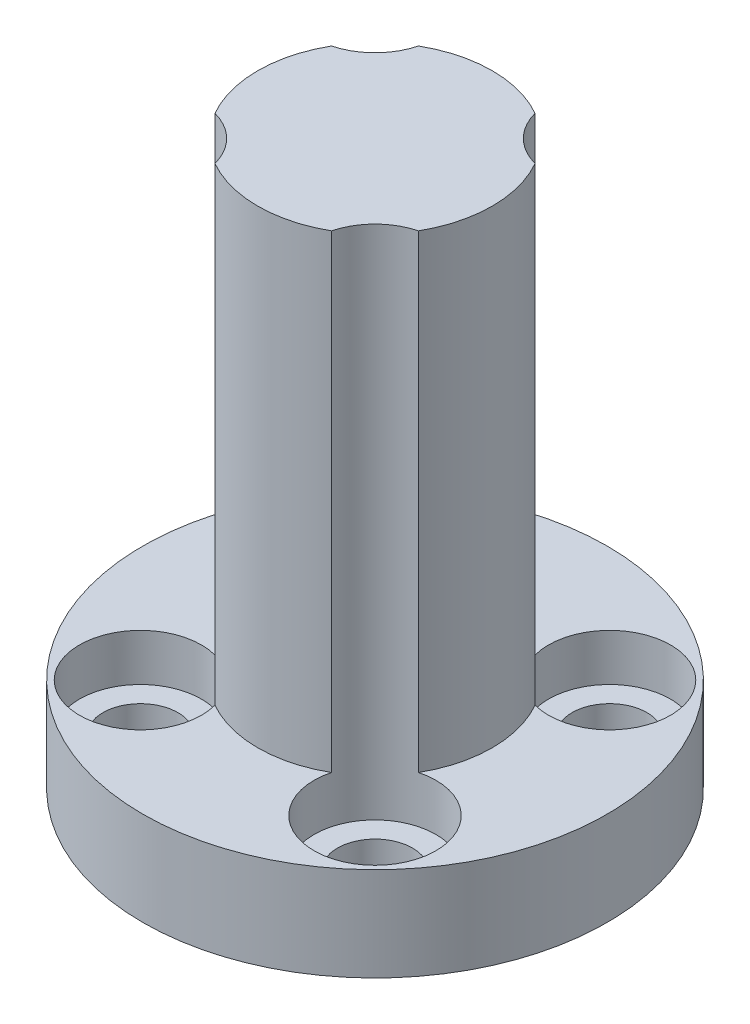
ISO-10303-21;
HEADER;
FILE_DESCRIPTION(('STEP AP214'),'2;1');
FILE_NAME('part.step','',(''),(''),'','','');
FILE_SCHEMA(('AUTOMOTIVE_DESIGN { 1 0 10303 214 1 1 1 1 }'));
ENDSEC;
DATA;
#1=APPLICATION_CONTEXT('core data for automotive mechanical design processes');
#2=APPLICATION_PROTOCOL_DEFINITION('international standard','automotive_design',2000,#1);
#3=PRODUCT_CONTEXT('',#1,'mechanical');
#4=PRODUCT('Part','Part','',(#3));
#5=PRODUCT_RELATED_PRODUCT_CATEGORY('part','',(#4));
#6=PRODUCT_DEFINITION_FORMATION('','',#4);
#7=PRODUCT_DEFINITION_CONTEXT('part definition',#1,'design');
#8=PRODUCT_DEFINITION('design','',#6,#7);
#9=PRODUCT_DEFINITION_SHAPE('','',#8);
#10=(LENGTH_UNIT() NAMED_UNIT(*) SI_UNIT(.MILLI.,.METRE.));
#11=(NAMED_UNIT(*) PLANE_ANGLE_UNIT() SI_UNIT($,.RADIAN.));
#12=(NAMED_UNIT(*) SI_UNIT($,.STERADIAN.) SOLID_ANGLE_UNIT());
#13=UNCERTAINTY_MEASURE_WITH_UNIT(LENGTH_MEASURE(1.E-05),#10,'distance_accuracy_value','');
#14=(GEOMETRIC_REPRESENTATION_CONTEXT(3) GLOBAL_UNCERTAINTY_ASSIGNED_CONTEXT((#13)) GLOBAL_UNIT_ASSIGNED_CONTEXT((#10,
#11,#12)) REPRESENTATION_CONTEXT('',''));
#15=CARTESIAN_POINT('',(0.,0.,0.));
#16=DIRECTION('',(0.,0.,1.));
#17=DIRECTION('',(1.,0.,0.));
#18=AXIS2_PLACEMENT_3D('',#15,#16,#17);
#19=CARTESIAN_POINT('',(5.,-0.00100000000000013,-5.));
#20=DIRECTION('',(0.,1.,0.));
#21=DIRECTION('',(0.,0.,1.));
#22=AXIS2_PLACEMENT_3D('',#19,#20,#21);
#23=CYLINDRICAL_SURFACE('',#22,1.6);
#24=CARTESIAN_POINT('',(5.,0.,-5.));
#25=DIRECTION('',(0.,1.,0.));
#26=DIRECTION('',(0.,0.,1.));
#27=AXIS2_PLACEMENT_3D('',#24,#25,#26);
#28=CIRCLE('',#27,1.6);
#29=CARTESIAN_POINT('',(5.,0.,-3.4));
#30=VERTEX_POINT('',#29);
#31=EDGE_CURVE('E165',#30,#30,#28,.F.);
#32=ORIENTED_EDGE('',*,*,#31,.T.);
#33=EDGE_LOOP('',(#32));
#34=FACE_BOUND('',#33,.T.);
#35=CARTESIAN_POINT('',(5.,2.,-5.));
#36=DIRECTION('',(0.,1.,0.));
#37=DIRECTION('',(0.,0.,1.));
#38=AXIS2_PLACEMENT_3D('',#35,#36,#37);
#39=CIRCLE('',#38,1.6);
#40=CARTESIAN_POINT('',(5.,2.,-3.4));
#41=VERTEX_POINT('',#40);
#42=EDGE_CURVE('E245',#41,#41,#39,.T.);
#43=ORIENTED_EDGE('',*,*,#42,.T.);
#44=EDGE_LOOP('',(#43));
#45=FACE_BOUND('',#44,.T.);
#46=ADVANCED_FACE('F45',(#34,#45),#23,.F.);
#47=CARTESIAN_POINT('',(5.,-0.00100000000000013,5.));
#48=DIRECTION('',(0.,1.,0.));
#49=DIRECTION('',(0.,0.,1.));
#50=AXIS2_PLACEMENT_3D('',#47,#48,#49);
#51=CYLINDRICAL_SURFACE('',#50,1.6);
#52=CARTESIAN_POINT('',(5.,0.,5.));
#53=DIRECTION('',(0.,1.,0.));
#54=DIRECTION('',(0.,0.,1.));
#55=AXIS2_PLACEMENT_3D('',#52,#53,#54);
#56=CIRCLE('',#55,1.6);
#57=CARTESIAN_POINT('',(5.,0.,6.6));
#58=VERTEX_POINT('',#57);
#59=EDGE_CURVE('E171',#58,#58,#56,.F.);
#60=ORIENTED_EDGE('',*,*,#59,.T.);
#61=EDGE_LOOP('',(#60));
#62=FACE_BOUND('',#61,.T.);
#63=CARTESIAN_POINT('',(5.,2.,5.));
#64=DIRECTION('',(0.,1.,0.));
#65=DIRECTION('',(0.,0.,1.));
#66=AXIS2_PLACEMENT_3D('',#63,#64,#65);
#67=CIRCLE('',#66,1.6);
#68=CARTESIAN_POINT('',(5.,2.,6.6));
#69=VERTEX_POINT('',#68);
#70=EDGE_CURVE('E234',#69,#69,#67,.T.);
#71=ORIENTED_EDGE('',*,*,#70,.T.);
#72=EDGE_LOOP('',(#71));
#73=FACE_BOUND('',#72,.T.);
#74=ADVANCED_FACE('F284',(#62,#73),#51,.F.);
#75=CARTESIAN_POINT('',(-5.,-0.00100000000000013,5.));
#76=DIRECTION('',(0.,1.,0.));
#77=DIRECTION('',(0.,0.,1.));
#78=AXIS2_PLACEMENT_3D('',#75,#76,#77);
#79=CYLINDRICAL_SURFACE('',#78,1.6);
#80=CARTESIAN_POINT('',(-5.,0.,5.));
#81=DIRECTION('',(0.,1.,0.));
#82=DIRECTION('',(0.,0.,1.));
#83=AXIS2_PLACEMENT_3D('',#80,#81,#82);
#84=CIRCLE('',#83,1.6);
#85=CARTESIAN_POINT('',(-5.,0.,6.6));
#86=VERTEX_POINT('',#85);
#87=EDGE_CURVE('E176',#86,#86,#84,.F.);
#88=ORIENTED_EDGE('',*,*,#87,.T.);
#89=EDGE_LOOP('',(#88));
#90=FACE_BOUND('',#89,.T.);
#91=CARTESIAN_POINT('',(-5.,2.,5.));
#92=DIRECTION('',(0.,1.,0.));
#93=DIRECTION('',(0.,0.,1.));
#94=AXIS2_PLACEMENT_3D('',#91,#92,#93);
#95=CIRCLE('',#94,1.6);
#96=CARTESIAN_POINT('',(-5.,2.,6.6));
#97=VERTEX_POINT('',#96);
#98=EDGE_CURVE('E223',#97,#97,#95,.T.);
#99=ORIENTED_EDGE('',*,*,#98,.T.);
#100=EDGE_LOOP('',(#99));
#101=FACE_BOUND('',#100,.T.);
#102=ADVANCED_FACE('F290',(#90,#101),#79,.F.);
#103=CARTESIAN_POINT('',(-5.,-0.00100000000000013,-5.));
#104=DIRECTION('',(0.,1.,0.));
#105=DIRECTION('',(0.,0.,1.));
#106=AXIS2_PLACEMENT_3D('',#103,#104,#105);
#107=CYLINDRICAL_SURFACE('',#106,1.6);
#108=CARTESIAN_POINT('',(-5.,0.,-5.));
#109=DIRECTION('',(0.,1.,0.));
#110=DIRECTION('',(0.,0.,1.));
#111=AXIS2_PLACEMENT_3D('',#108,#109,#110);
#112=CIRCLE('',#111,1.6);
#113=CARTESIAN_POINT('',(-5.,0.,-3.4));
#114=VERTEX_POINT('',#113);
#115=EDGE_CURVE('E179',#114,#114,#112,.F.);
#116=ORIENTED_EDGE('',*,*,#115,.T.);
#117=EDGE_LOOP('',(#116));
#118=FACE_BOUND('',#117,.T.);
#119=CARTESIAN_POINT('',(-5.,2.,-5.));
#120=DIRECTION('',(0.,1.,0.));
#121=DIRECTION('',(0.,0.,1.));
#122=AXIS2_PLACEMENT_3D('',#119,#120,#121);
#123=CIRCLE('',#122,1.6);
#124=CARTESIAN_POINT('',(-5.,2.,-3.4));
#125=VERTEX_POINT('',#124);
#126=EDGE_CURVE('E123',#125,#125,#123,.T.);
#127=ORIENTED_EDGE('',*,*,#126,.T.);
#128=EDGE_LOOP('',(#127));
#129=FACE_BOUND('',#128,.T.);
#130=ADVANCED_FACE('F295',(#118,#129),#107,.F.);
#131=CARTESIAN_POINT('',(0.,24.,0.));
#132=DIRECTION('',(0.,-1.,0.));
#133=DIRECTION('',(0.,0.,-1.));
#134=AXIS2_PLACEMENT_3D('',#131,#132,#133);
#135=CYLINDRICAL_SURFACE('',#134,5.);
#136=DIRECTION('',(0.,-1.,0.));
#137=VECTOR('',#136,1.);
#138=CARTESIAN_POINT('',(-2.48557892942788,14.,-4.33842107057212));
#139=LINE('',#138,#137);
#140=CARTESIAN_POINT('',(-2.48557892942788,4.,-4.33842107057212));
#141=VERTEX_POINT('',#140);
#142=CARTESIAN_POINT('',(-2.48557892942788,24.,-4.33842107057212));
#143=VERTEX_POINT('',#142);
#144=EDGE_CURVE('E126',#141,#143,#139,.F.);
#145=ORIENTED_EDGE('',*,*,#144,.T.);
#146=CARTESIAN_POINT('',(0.,24.,0.));
#147=DIRECTION('',(0.,1.,0.));
#148=DIRECTION('',(0.,0.,1.));
#149=AXIS2_PLACEMENT_3D('',#146,#147,#148);
#150=CIRCLE('',#149,5.);
#151=CARTESIAN_POINT('',(2.48557892942788,24.,-4.33842107057212));
#152=VERTEX_POINT('',#151);
#153=EDGE_CURVE('E156',#152,#143,#150,.T.);
#154=ORIENTED_EDGE('',*,*,#153,.F.);
#155=DIRECTION('',(0.,-1.,0.));
#156=VECTOR('',#155,1.);
#157=CARTESIAN_POINT('',(2.48557892942787,14.,-4.33842107057212));
#158=LINE('',#157,#156);
#159=CARTESIAN_POINT('',(2.48557892942788,4.,-4.33842107057212));
#160=VERTEX_POINT('',#159);
#161=EDGE_CURVE('E137',#152,#160,#158,.T.);
#162=ORIENTED_EDGE('',*,*,#161,.T.);
#163=CARTESIAN_POINT('',(0.,4.,0.));
#164=DIRECTION('',(0.,1.,0.));
#165=DIRECTION('',(0.,0.,1.));
#166=AXIS2_PLACEMENT_3D('',#163,#164,#165);
#167=CIRCLE('',#166,5.);
#168=EDGE_CURVE('E55',#160,#141,#167,.T.);
#169=ORIENTED_EDGE('',*,*,#168,.T.);
#170=EDGE_LOOP('',(#145,#154,#162,#169));
#171=FACE_BOUND('',#170,.T.);
#172=ADVANCED_FACE('F136',(#171),#135,.T.);
#173=DIRECTION('',(0.,-1.,0.));
#174=VECTOR('',#173,1.);
#175=CARTESIAN_POINT('',(-4.33842107057212,14.,-2.48557892942788));
#176=LINE('',#175,#174);
#177=CARTESIAN_POINT('',(-4.33842107057212,24.,-2.48557892942788));
#178=VERTEX_POINT('',#177);
#179=CARTESIAN_POINT('',(-4.33842107057212,4.,-2.48557892942788));
#180=VERTEX_POINT('',#179);
#181=EDGE_CURVE('E72',#178,#180,#176,.T.);
#182=ORIENTED_EDGE('',*,*,#181,.T.);
#183=CARTESIAN_POINT('',(-4.33842107057212,4.,2.48557892942788));
#184=VERTEX_POINT('',#183);
#185=EDGE_CURVE('E120',#180,#184,#167,.T.);
#186=ORIENTED_EDGE('',*,*,#185,.T.);
#187=DIRECTION('',(0.,-1.,0.));
#188=VECTOR('',#187,1.);
#189=CARTESIAN_POINT('',(-4.33842107057212,14.,2.48557892942788));
#190=LINE('',#189,#188);
#191=CARTESIAN_POINT('',(-4.33842107057212,24.,2.48557892942788));
#192=VERTEX_POINT('',#191);
#193=EDGE_CURVE('E188',#184,#192,#190,.F.);
#194=ORIENTED_EDGE('',*,*,#193,.T.);
#195=EDGE_CURVE('E162',#178,#192,#150,.T.);
#196=ORIENTED_EDGE('',*,*,#195,.F.);
#197=EDGE_LOOP('',(#182,#186,#194,#196));
#198=FACE_BOUND('',#197,.T.);
#199=ADVANCED_FACE('F301',(#198),#135,.T.);
#200=DIRECTION('',(0.,-1.,0.));
#201=VECTOR('',#200,1.);
#202=CARTESIAN_POINT('',(2.48557892942787,14.,4.33842107057212));
#203=LINE('',#202,#201);
#204=CARTESIAN_POINT('',(2.48557892942788,4.,4.33842107057212));
#205=VERTEX_POINT('',#204);
#206=CARTESIAN_POINT('',(2.48557892942788,24.,4.33842107057212));
#207=VERTEX_POINT('',#206);
#208=EDGE_CURVE('E206',#205,#207,#203,.F.);
#209=ORIENTED_EDGE('',*,*,#208,.T.);
#210=CARTESIAN_POINT('',(-2.48557892942788,24.,4.33842107057212));
#211=VERTEX_POINT('',#210);
#212=EDGE_CURVE('E144',#211,#207,#150,.T.);
#213=ORIENTED_EDGE('',*,*,#212,.F.);
#214=DIRECTION('',(0.,-1.,0.));
#215=VECTOR('',#214,1.);
#216=CARTESIAN_POINT('',(-2.48557892942788,14.,4.33842107057212));
#217=LINE('',#216,#215);
#218=CARTESIAN_POINT('',(-2.48557892942788,4.,4.33842107057212));
#219=VERTEX_POINT('',#218);
#220=EDGE_CURVE('E64',#211,#219,#217,.T.);
#221=ORIENTED_EDGE('',*,*,#220,.T.);
#222=EDGE_CURVE('E57',#219,#205,#167,.T.);
#223=ORIENTED_EDGE('',*,*,#222,.T.);
#224=EDGE_LOOP('',(#209,#213,#221,#223));
#225=FACE_BOUND('',#224,.T.);
#226=ADVANCED_FACE('F426',(#225),#135,.T.);
#227=DIRECTION('',(0.,-1.,0.));
#228=VECTOR('',#227,1.);
#229=CARTESIAN_POINT('',(4.33842107057212,14.,2.48557892942787));
#230=LINE('',#229,#228);
#231=CARTESIAN_POINT('',(4.33842107057212,24.,2.48557892942788));
#232=VERTEX_POINT('',#231);
#233=CARTESIAN_POINT('',(4.33842107057212,4.,2.48557892942788));
#234=VERTEX_POINT('',#233);
#235=EDGE_CURVE('E201',#232,#234,#230,.T.);
#236=ORIENTED_EDGE('',*,*,#235,.T.);
#237=CARTESIAN_POINT('',(4.33842107057212,4.,-2.48557892942788));
#238=VERTEX_POINT('',#237);
#239=EDGE_CURVE('E11',#234,#238,#167,.T.);
#240=ORIENTED_EDGE('',*,*,#239,.T.);
#241=DIRECTION('',(0.,-1.,0.));
#242=VECTOR('',#241,1.);
#243=CARTESIAN_POINT('',(4.33842107057212,14.,-2.48557892942787));
#244=LINE('',#243,#242);
#245=CARTESIAN_POINT('',(4.33842107057212,24.,-2.48557892942788));
#246=VERTEX_POINT('',#245);
#247=EDGE_CURVE('E214',#238,#246,#244,.F.);
#248=ORIENTED_EDGE('',*,*,#247,.T.);
#249=EDGE_CURVE('E151',#232,#246,#150,.T.);
#250=ORIENTED_EDGE('',*,*,#249,.F.);
#251=EDGE_LOOP('',(#236,#240,#248,#250));
#252=FACE_BOUND('',#251,.T.);
#253=ADVANCED_FACE('F302',(#252),#135,.T.);
#254=CARTESIAN_POINT('',(0.,4.,0.));
#255=DIRECTION('',(0.,-1.,0.));
#256=DIRECTION('',(0.,0.,-1.));
#257=AXIS2_PLACEMENT_3D('',#254,#255,#256);
#258=CYLINDRICAL_SURFACE('',#257,9.9);
#259=CARTESIAN_POINT('',(0.,4.,0.));
#260=DIRECTION('',(0.,1.,0.));
#261=DIRECTION('',(0.,0.,1.));
#262=AXIS2_PLACEMENT_3D('',#259,#260,#261);
#263=CIRCLE('',#262,9.9);
#264=CARTESIAN_POINT('',(0.,4.,9.9));
#265=VERTEX_POINT('',#264);
#266=EDGE_CURVE('E143',#265,#265,#263,.T.);
#267=ORIENTED_EDGE('',*,*,#266,.F.);
#268=EDGE_LOOP('',(#267));
#269=FACE_BOUND('',#268,.T.);
#270=CARTESIAN_POINT('',(0.,0.,0.));
#271=DIRECTION('',(0.,1.,0.));
#272=DIRECTION('',(0.,0.,1.));
#273=AXIS2_PLACEMENT_3D('',#270,#271,#272);
#274=CIRCLE('',#273,9.9);
#275=CARTESIAN_POINT('',(0.,0.,9.9));
#276=VERTEX_POINT('',#275);
#277=EDGE_CURVE('E49',#276,#276,#274,.T.);
#278=ORIENTED_EDGE('',*,*,#277,.T.);
#279=EDGE_LOOP('',(#278));
#280=FACE_BOUND('',#279,.T.);
#281=ADVANCED_FACE('F47',(#269,#280),#258,.T.);
#282=CARTESIAN_POINT('',(0.,4.,0.));
#283=DIRECTION('',(0.,1.,0.));
#284=DIRECTION('',(0.,0.,1.));
#285=AXIS2_PLACEMENT_3D('',#282,#283,#284);
#286=PLANE('',#285);
#287=CARTESIAN_POINT('',(-5.,4.,-5.));
#288=DIRECTION('',(0.,1.,0.));
#289=DIRECTION('',(0.,0.,1.));
#290=AXIS2_PLACEMENT_3D('',#287,#288,#289);
#291=CIRCLE('',#290,2.6);
#292=EDGE_CURVE('E114',#141,#180,#291,.T.);
#293=ORIENTED_EDGE('',*,*,#292,.F.);
#294=ORIENTED_EDGE('',*,*,#168,.F.);
#295=CARTESIAN_POINT('',(5.,4.,-5.));
#296=DIRECTION('',(0.,1.,0.));
#297=DIRECTION('',(0.,0.,1.));
#298=AXIS2_PLACEMENT_3D('',#295,#296,#297);
#299=CIRCLE('',#298,2.6);
#300=EDGE_CURVE('E249',#238,#160,#299,.T.);
#301=ORIENTED_EDGE('',*,*,#300,.F.);
#302=ORIENTED_EDGE('',*,*,#239,.F.);
#303=CARTESIAN_POINT('',(5.,4.,5.));
#304=DIRECTION('',(0.,1.,0.));
#305=DIRECTION('',(0.,0.,1.));
#306=AXIS2_PLACEMENT_3D('',#303,#304,#305);
#307=CIRCLE('',#306,2.6);
#308=EDGE_CURVE('E238',#205,#234,#307,.T.);
#309=ORIENTED_EDGE('',*,*,#308,.F.);
#310=ORIENTED_EDGE('',*,*,#222,.F.);
#311=CARTESIAN_POINT('',(-5.,4.,5.));
#312=DIRECTION('',(0.,1.,0.));
#313=DIRECTION('',(0.,0.,1.));
#314=AXIS2_PLACEMENT_3D('',#311,#312,#313);
#315=CIRCLE('',#314,2.6);
#316=EDGE_CURVE('E220',#184,#219,#315,.T.);
#317=ORIENTED_EDGE('',*,*,#316,.F.);
#318=ORIENTED_EDGE('',*,*,#185,.F.);
#319=EDGE_LOOP('',(#293,#294,#301,#302,#309,#310,#317,#318));
#320=FACE_BOUND('',#319,.T.);
#321=ORIENTED_EDGE('',*,*,#266,.T.);
#322=EDGE_LOOP('',(#321));
#323=FACE_BOUND('',#322,.T.);
#324=ADVANCED_FACE('F116',(#320,#323),#286,.T.);
#325=CARTESIAN_POINT('',(0.,0.,0.));
#326=DIRECTION('',(0.,1.,0.));
#327=DIRECTION('',(0.,0.,1.));
#328=AXIS2_PLACEMENT_3D('',#325,#326,#327);
#329=PLANE('',#328);
#330=ORIENTED_EDGE('',*,*,#115,.F.);
#331=EDGE_LOOP('',(#330));
#332=FACE_BOUND('',#331,.T.);
#333=ORIENTED_EDGE('',*,*,#87,.F.);
#334=EDGE_LOOP('',(#333));
#335=FACE_BOUND('',#334,.T.);
#336=ORIENTED_EDGE('',*,*,#59,.F.);
#337=EDGE_LOOP('',(#336));
#338=FACE_BOUND('',#337,.T.);
#339=ORIENTED_EDGE('',*,*,#31,.F.);
#340=EDGE_LOOP('',(#339));
#341=FACE_BOUND('',#340,.T.);
#342=ORIENTED_EDGE('',*,*,#277,.F.);
#343=EDGE_LOOP('',(#342));
#344=FACE_BOUND('',#343,.T.);
#345=ADVANCED_FACE('F298',(#332,#335,#338,#341,#344),#329,.F.);
#346=CARTESIAN_POINT('',(0.,24.,0.));
#347=DIRECTION('',(0.,1.,0.));
#348=DIRECTION('',(0.,0.,1.));
#349=AXIS2_PLACEMENT_3D('',#346,#347,#348);
#350=PLANE('',#349);
#351=ORIENTED_EDGE('',*,*,#153,.T.);
#352=CARTESIAN_POINT('',(-5.,24.,-5.));
#353=DIRECTION('',(0.,1.,0.));
#354=DIRECTION('',(0.,0.,1.));
#355=AXIS2_PLACEMENT_3D('',#352,#353,#354);
#356=CIRCLE('',#355,2.6);
#357=EDGE_CURVE('E129',#178,#143,#356,.T.);
#358=ORIENTED_EDGE('',*,*,#357,.F.);
#359=ORIENTED_EDGE('',*,*,#195,.T.);
#360=CARTESIAN_POINT('',(-5.,24.,5.));
#361=DIRECTION('',(0.,1.,0.));
#362=DIRECTION('',(0.,0.,1.));
#363=AXIS2_PLACEMENT_3D('',#360,#361,#362);
#364=CIRCLE('',#363,2.6);
#365=EDGE_CURVE('E192',#211,#192,#364,.T.);
#366=ORIENTED_EDGE('',*,*,#365,.F.);
#367=ORIENTED_EDGE('',*,*,#212,.T.);
#368=CARTESIAN_POINT('',(5.,24.,5.));
#369=DIRECTION('',(0.,1.,0.));
#370=DIRECTION('',(0.,0.,1.));
#371=AXIS2_PLACEMENT_3D('',#368,#369,#370);
#372=CIRCLE('',#371,2.6);
#373=EDGE_CURVE('E196',#232,#207,#372,.T.);
#374=ORIENTED_EDGE('',*,*,#373,.F.);
#375=ORIENTED_EDGE('',*,*,#249,.T.);
#376=CARTESIAN_POINT('',(5.,24.,-5.));
#377=DIRECTION('',(0.,1.,0.));
#378=DIRECTION('',(0.,0.,1.));
#379=AXIS2_PLACEMENT_3D('',#376,#377,#378);
#380=CIRCLE('',#379,2.6);
#381=EDGE_CURVE('E205',#152,#246,#380,.T.);
#382=ORIENTED_EDGE('',*,*,#381,.F.);
#383=EDGE_LOOP('',(#351,#358,#359,#366,#367,#374,#375,#382));
#384=FACE_BOUND('',#383,.T.);
#385=ADVANCED_FACE('F280',(#384),#350,.T.);
#386=CARTESIAN_POINT('',(-5.,24.001,5.));
#387=DIRECTION('',(0.,-1.,0.));
#388=DIRECTION('',(0.,0.,-1.));
#389=AXIS2_PLACEMENT_3D('',#386,#387,#388);
#390=CYLINDRICAL_SURFACE('',#389,2.6);
#391=ORIENTED_EDGE('',*,*,#365,.T.);
#392=ORIENTED_EDGE('',*,*,#193,.F.);
#393=ORIENTED_EDGE('',*,*,#316,.T.);
#394=ORIENTED_EDGE('',*,*,#220,.F.);
#395=EDGE_LOOP('',(#391,#392,#393,#394));
#396=FACE_BOUND('',#395,.T.);
#397=CARTESIAN_POINT('',(-5.,2.,5.));
#398=DIRECTION('',(0.,1.,0.));
#399=DIRECTION('',(0.,0.,1.));
#400=AXIS2_PLACEMENT_3D('',#397,#398,#399);
#401=CIRCLE('',#400,2.6);
#402=CARTESIAN_POINT('',(-5.,2.,7.6));
#403=VERTEX_POINT('',#402);
#404=EDGE_CURVE('E200',#403,#403,#401,.T.);
#405=ORIENTED_EDGE('',*,*,#404,.F.);
#406=EDGE_LOOP('',(#405));
#407=FACE_BOUND('',#406,.T.);
#408=ADVANCED_FACE('F271',(#396,#407),#390,.F.);
#409=CARTESIAN_POINT('',(5.,24.001,-5.));
#410=DIRECTION('',(0.,-1.,0.));
#411=DIRECTION('',(0.,0.,-1.));
#412=AXIS2_PLACEMENT_3D('',#409,#410,#411);
#413=CYLINDRICAL_SURFACE('',#412,2.6);
#414=ORIENTED_EDGE('',*,*,#381,.T.);
#415=ORIENTED_EDGE('',*,*,#247,.F.);
#416=ORIENTED_EDGE('',*,*,#300,.T.);
#417=ORIENTED_EDGE('',*,*,#161,.F.);
#418=EDGE_LOOP('',(#414,#415,#416,#417));
#419=FACE_BOUND('',#418,.T.);
#420=CARTESIAN_POINT('',(5.,2.,-5.));
#421=DIRECTION('',(0.,1.,0.));
#422=DIRECTION('',(0.,0.,1.));
#423=AXIS2_PLACEMENT_3D('',#420,#421,#422);
#424=CIRCLE('',#423,2.6);
#425=CARTESIAN_POINT('',(5.,2.,-2.4));
#426=VERTEX_POINT('',#425);
#427=EDGE_CURVE('E229',#426,#426,#424,.T.);
#428=ORIENTED_EDGE('',*,*,#427,.F.);
#429=EDGE_LOOP('',(#428));
#430=FACE_BOUND('',#429,.T.);
#431=ADVANCED_FACE('F268',(#419,#430),#413,.F.);
#432=CARTESIAN_POINT('',(5.,24.001,5.));
#433=DIRECTION('',(0.,-1.,0.));
#434=DIRECTION('',(0.,0.,-1.));
#435=AXIS2_PLACEMENT_3D('',#432,#433,#434);
#436=CYLINDRICAL_SURFACE('',#435,2.6);
#437=ORIENTED_EDGE('',*,*,#373,.T.);
#438=ORIENTED_EDGE('',*,*,#208,.F.);
#439=ORIENTED_EDGE('',*,*,#308,.T.);
#440=ORIENTED_EDGE('',*,*,#235,.F.);
#441=EDGE_LOOP('',(#437,#438,#439,#440));
#442=FACE_BOUND('',#441,.T.);
#443=CARTESIAN_POINT('',(5.,2.,5.));
#444=DIRECTION('',(0.,1.,0.));
#445=DIRECTION('',(0.,0.,1.));
#446=AXIS2_PLACEMENT_3D('',#443,#444,#445);
#447=CIRCLE('',#446,2.6);
#448=CARTESIAN_POINT('',(5.,2.,7.6));
#449=VERTEX_POINT('',#448);
#450=EDGE_CURVE('E241',#449,#449,#447,.T.);
#451=ORIENTED_EDGE('',*,*,#450,.F.);
#452=EDGE_LOOP('',(#451));
#453=FACE_BOUND('',#452,.T.);
#454=ADVANCED_FACE('F270',(#442,#453),#436,.F.);
#455=CARTESIAN_POINT('',(-5.,24.001,-5.));
#456=DIRECTION('',(0.,-1.,0.));
#457=DIRECTION('',(0.,0.,-1.));
#458=AXIS2_PLACEMENT_3D('',#455,#456,#457);
#459=CYLINDRICAL_SURFACE('',#458,2.6);
#460=ORIENTED_EDGE('',*,*,#357,.T.);
#461=ORIENTED_EDGE('',*,*,#144,.F.);
#462=ORIENTED_EDGE('',*,*,#292,.T.);
#463=ORIENTED_EDGE('',*,*,#181,.F.);
#464=EDGE_LOOP('',(#460,#461,#462,#463));
#465=FACE_BOUND('',#464,.T.);
#466=CARTESIAN_POINT('',(-5.,2.,-5.));
#467=DIRECTION('',(0.,1.,0.));
#468=DIRECTION('',(0.,0.,1.));
#469=AXIS2_PLACEMENT_3D('',#466,#467,#468);
#470=CIRCLE('',#469,2.6);
#471=CARTESIAN_POINT('',(-5.,2.,-2.4));
#472=VERTEX_POINT('',#471);
#473=EDGE_CURVE('E122',#472,#472,#470,.T.);
#474=ORIENTED_EDGE('',*,*,#473,.F.);
#475=EDGE_LOOP('',(#474));
#476=FACE_BOUND('',#475,.T.);
#477=ADVANCED_FACE('F127',(#465,#476),#459,.F.);
#478=CARTESIAN_POINT('',(-5.,2.,-5.));
#479=DIRECTION('',(0.,1.,0.));
#480=DIRECTION('',(0.,0.,1.));
#481=AXIS2_PLACEMENT_3D('',#478,#479,#480);
#482=PLANE('',#481);
#483=ORIENTED_EDGE('',*,*,#126,.F.);
#484=EDGE_LOOP('',(#483));
#485=FACE_BOUND('',#484,.T.);
#486=ORIENTED_EDGE('',*,*,#473,.T.);
#487=EDGE_LOOP('',(#486));
#488=FACE_BOUND('',#487,.T.);
#489=ADVANCED_FACE('F321',(#485,#488),#482,.T.);
#490=CARTESIAN_POINT('',(5.,2.,5.));
#491=DIRECTION('',(0.,1.,0.));
#492=DIRECTION('',(0.,0.,1.));
#493=AXIS2_PLACEMENT_3D('',#490,#491,#492);
#494=PLANE('',#493);
#495=ORIENTED_EDGE('',*,*,#70,.F.);
#496=EDGE_LOOP('',(#495));
#497=FACE_BOUND('',#496,.T.);
#498=ORIENTED_EDGE('',*,*,#450,.T.);
#499=EDGE_LOOP('',(#498));
#500=FACE_BOUND('',#499,.T.);
#501=ADVANCED_FACE('F264',(#497,#500),#494,.T.);
#502=CARTESIAN_POINT('',(5.,2.,-5.));
#503=DIRECTION('',(0.,1.,0.));
#504=DIRECTION('',(0.,0.,1.));
#505=AXIS2_PLACEMENT_3D('',#502,#503,#504);
#506=PLANE('',#505);
#507=ORIENTED_EDGE('',*,*,#42,.F.);
#508=EDGE_LOOP('',(#507));
#509=FACE_BOUND('',#508,.T.);
#510=ORIENTED_EDGE('',*,*,#427,.T.);
#511=EDGE_LOOP('',(#510));
#512=FACE_BOUND('',#511,.T.);
#513=ADVANCED_FACE('F260',(#509,#512),#506,.T.);
#514=CARTESIAN_POINT('',(-5.,2.,5.));
#515=DIRECTION('',(0.,1.,0.));
#516=DIRECTION('',(0.,0.,1.));
#517=AXIS2_PLACEMENT_3D('',#514,#515,#516);
#518=PLANE('',#517);
#519=ORIENTED_EDGE('',*,*,#98,.F.);
#520=EDGE_LOOP('',(#519));
#521=FACE_BOUND('',#520,.T.);
#522=ORIENTED_EDGE('',*,*,#404,.T.);
#523=EDGE_LOOP('',(#522));
#524=FACE_BOUND('',#523,.T.);
#525=ADVANCED_FACE('F263',(#521,#524),#518,.T.);
#526=CLOSED_SHELL('',(#46,#74,#102,#130,#172,#199,#226,#253,#281,#324,#345,#385,#408,#431,#454,
#477,#489,#501,#513,#525));
#527=MANIFOLD_SOLID_BREP('B2',#526);
#528=ADVANCED_BREP_SHAPE_REPRESENTATION('',(#18,#527),#14);
#529=SHAPE_DEFINITION_REPRESENTATION(#9,#528);
ENDSEC;
END-ISO-10303-21;
